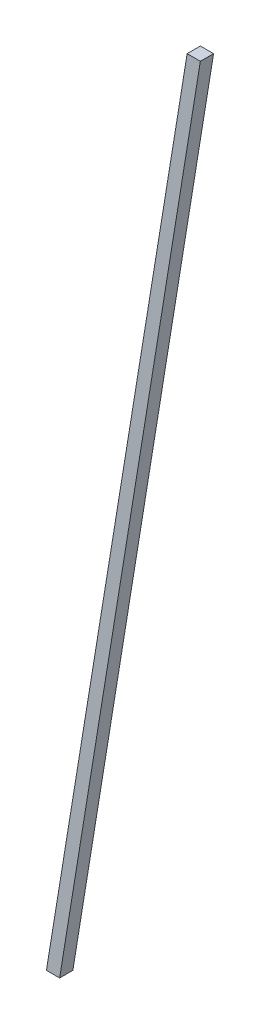
ISO-10303-21;
HEADER;
FILE_DESCRIPTION(('STEP AP214'),'2;1');
FILE_NAME('part.step','',(''),(''),'','','');
FILE_SCHEMA(('AUTOMOTIVE_DESIGN { 1 0 10303 214 1 1 1 1 }'));
ENDSEC;
DATA;
#1=APPLICATION_CONTEXT('core data for automotive mechanical design processes');
#2=APPLICATION_PROTOCOL_DEFINITION('international standard','automotive_design',2000,#1);
#3=PRODUCT_CONTEXT('',#1,'mechanical');
#4=PRODUCT('Part','Part','',(#3));
#5=PRODUCT_RELATED_PRODUCT_CATEGORY('part','',(#4));
#6=PRODUCT_DEFINITION_FORMATION('','',#4);
#7=PRODUCT_DEFINITION_CONTEXT('part definition',#1,'design');
#8=PRODUCT_DEFINITION('design','',#6,#7);
#9=PRODUCT_DEFINITION_SHAPE('','',#8);
#10=(LENGTH_UNIT() NAMED_UNIT(*) SI_UNIT(.MILLI.,.METRE.));
#11=(NAMED_UNIT(*) PLANE_ANGLE_UNIT() SI_UNIT($,.RADIAN.));
#12=(NAMED_UNIT(*) SI_UNIT($,.STERADIAN.) SOLID_ANGLE_UNIT());
#13=UNCERTAINTY_MEASURE_WITH_UNIT(LENGTH_MEASURE(1.E-05),#10,'distance_accuracy_value','');
#14=(GEOMETRIC_REPRESENTATION_CONTEXT(3) GLOBAL_UNCERTAINTY_ASSIGNED_CONTEXT((#13)) GLOBAL_UNIT_ASSIGNED_CONTEXT((#10,
#11,#12)) REPRESENTATION_CONTEXT('',''));
#15=CARTESIAN_POINT('',(0.,0.,0.));
#16=DIRECTION('',(0.,0.,1.));
#17=DIRECTION('',(1.,0.,0.));
#18=AXIS2_PLACEMENT_3D('',#15,#16,#17);
#19=CARTESIAN_POINT('',(72.0976824400948,329.578743165487,5.));
#20=DIRECTION('',(0.,-1.,0.));
#21=DIRECTION('',(0.,0.,-1.));
#22=AXIS2_PLACEMENT_3D('',#19,#20,#21);
#23=PLANE('',#22);
#24=DIRECTION('',(-1.,0.,0.));
#25=VECTOR('',#24,1.);
#26=CARTESIAN_POINT('',(72.0976824400948,329.578743165487,0.));
#27=LINE('',#26,#25);
#28=CARTESIAN_POINT('',(77.0976824400948,329.578743165487,0.));
#29=VERTEX_POINT('',#28);
#30=CARTESIAN_POINT('',(72.0976824400948,329.578743165487,0.));
#31=VERTEX_POINT('',#30);
#32=EDGE_CURVE('E96',#29,#31,#27,.T.);
#33=ORIENTED_EDGE('',*,*,#32,.T.);
#34=DIRECTION('',(0.,0.,-1.));
#35=VECTOR('',#34,1.);
#36=CARTESIAN_POINT('',(72.0976824400948,329.578743165487,5.));
#37=LINE('',#36,#35);
#38=CARTESIAN_POINT('',(72.0976824400948,329.578743165487,5.));
#39=VERTEX_POINT('',#38);
#40=EDGE_CURVE('E11',#39,#31,#37,.T.);
#41=ORIENTED_EDGE('',*,*,#40,.F.);
#42=DIRECTION('',(-1.,0.,0.));
#43=VECTOR('',#42,1.);
#44=CARTESIAN_POINT('',(72.0976824400948,329.578743165487,5.));
#45=LINE('',#44,#43);
#46=CARTESIAN_POINT('',(77.0976824400948,329.578743165487,5.));
#47=VERTEX_POINT('',#46);
#48=EDGE_CURVE('E84',#47,#39,#45,.T.);
#49=ORIENTED_EDGE('',*,*,#48,.F.);
#50=DIRECTION('',(0.,0.,-1.));
#51=VECTOR('',#50,1.);
#52=CARTESIAN_POINT('',(77.0976824400948,329.578743165487,5.));
#53=LINE('',#52,#51);
#54=EDGE_CURVE('E92',#47,#29,#53,.T.);
#55=ORIENTED_EDGE('',*,*,#54,.T.);
#56=EDGE_LOOP('',(#33,#41,#49,#55));
#57=FACE_BOUND('',#56,.T.);
#58=ADVANCED_FACE('F33',(#57),#23,.F.);
#59=CARTESIAN_POINT('',(72.0976824400948,329.578743165487,5.));
#60=DIRECTION('',(0.987003246317877,-0.16070031660819,0.));
#61=DIRECTION('',(0.16070031660819,0.987003246317877,0.));
#62=AXIS2_PLACEMENT_3D('',#59,#60,#61);
#63=PLANE('',#62);
#64=DIRECTION('',(-0.16070031660819,-0.987003246317877,0.));
#65=VECTOR('',#64,1.);
#66=CARTESIAN_POINT('',(72.0976824400948,329.578743165487,0.));
#67=LINE('',#66,#65);
#68=CARTESIAN_POINT('',(18.8567192245055,2.57874316549243,0.));
#69=VERTEX_POINT('',#68);
#70=EDGE_CURVE('E88',#31,#69,#67,.T.);
#71=ORIENTED_EDGE('',*,*,#70,.T.);
#72=DIRECTION('',(0.,0.,-1.));
#73=VECTOR('',#72,1.);
#74=CARTESIAN_POINT('',(18.8567192245055,2.57874316549243,5.));
#75=LINE('',#74,#73);
#76=CARTESIAN_POINT('',(18.8567192245055,2.57874316549243,5.));
#77=VERTEX_POINT('',#76);
#78=EDGE_CURVE('E41',#77,#69,#75,.T.);
#79=ORIENTED_EDGE('',*,*,#78,.F.);
#80=DIRECTION('',(-0.16070031660819,-0.987003246317877,0.));
#81=VECTOR('',#80,1.);
#82=CARTESIAN_POINT('',(72.0976824400948,329.578743165487,5.));
#83=LINE('',#82,#81);
#84=EDGE_CURVE('E79',#39,#77,#83,.T.);
#85=ORIENTED_EDGE('',*,*,#84,.F.);
#86=ORIENTED_EDGE('',*,*,#40,.T.);
#87=EDGE_LOOP('',(#71,#79,#85,#86));
#88=FACE_BOUND('',#87,.T.);
#89=ADVANCED_FACE('F87',(#88),#63,.F.);
#90=CARTESIAN_POINT('',(18.8567192245055,2.57874316549243,5.));
#91=DIRECTION('',(0.,1.,0.));
#92=DIRECTION('',(0.,0.,1.));
#93=AXIS2_PLACEMENT_3D('',#90,#91,#92);
#94=PLANE('',#93);
#95=DIRECTION('',(1.,0.,0.));
#96=VECTOR('',#95,1.);
#97=CARTESIAN_POINT('',(18.8567192245055,2.57874316549243,0.));
#98=LINE('',#97,#96);
#99=CARTESIAN_POINT('',(23.8567192245055,2.57874316549243,0.));
#100=VERTEX_POINT('',#99);
#101=EDGE_CURVE('E66',#69,#100,#98,.T.);
#102=ORIENTED_EDGE('',*,*,#101,.T.);
#103=DIRECTION('',(0.,0.,-1.));
#104=VECTOR('',#103,1.);
#105=CARTESIAN_POINT('',(23.8567192245055,2.57874316549243,5.));
#106=LINE('',#105,#104);
#107=CARTESIAN_POINT('',(23.8567192245055,2.57874316549243,5.));
#108=VERTEX_POINT('',#107);
#109=EDGE_CURVE('E89',#108,#100,#106,.T.);
#110=ORIENTED_EDGE('',*,*,#109,.F.);
#111=DIRECTION('',(1.,0.,0.));
#112=VECTOR('',#111,1.);
#113=CARTESIAN_POINT('',(18.8567192245055,2.57874316549243,5.));
#114=LINE('',#113,#112);
#115=EDGE_CURVE('E82',#77,#108,#114,.T.);
#116=ORIENTED_EDGE('',*,*,#115,.F.);
#117=ORIENTED_EDGE('',*,*,#78,.T.);
#118=EDGE_LOOP('',(#102,#110,#116,#117));
#119=FACE_BOUND('',#118,.T.);
#120=ADVANCED_FACE('F90',(#119),#94,.F.);
#121=CARTESIAN_POINT('',(77.0976824400948,329.578743165487,5.));
#122=DIRECTION('',(-0.987003246317877,0.16070031660819,0.));
#123=DIRECTION('',(-0.16070031660819,-0.987003246317877,0.));
#124=AXIS2_PLACEMENT_3D('',#121,#122,#123);
#125=PLANE('',#124);
#126=DIRECTION('',(0.16070031660819,0.987003246317877,0.));
#127=VECTOR('',#126,1.);
#128=CARTESIAN_POINT('',(77.0976824400948,329.578743165487,0.));
#129=LINE('',#128,#127);
#130=EDGE_CURVE('E72',#100,#29,#129,.T.);
#131=ORIENTED_EDGE('',*,*,#130,.T.);
#132=ORIENTED_EDGE('',*,*,#54,.F.);
#133=DIRECTION('',(0.16070031660819,0.987003246317877,0.));
#134=VECTOR('',#133,1.);
#135=CARTESIAN_POINT('',(77.0976824400948,329.578743165487,5.));
#136=LINE('',#135,#134);
#137=EDGE_CURVE('E49',#108,#47,#136,.T.);
#138=ORIENTED_EDGE('',*,*,#137,.F.);
#139=ORIENTED_EDGE('',*,*,#109,.T.);
#140=EDGE_LOOP('',(#131,#132,#138,#139));
#141=FACE_BOUND('',#140,.T.);
#142=ADVANCED_FACE('F103',(#141),#125,.F.);
#143=CARTESIAN_POINT('',(0.,0.,5.));
#144=DIRECTION('',(0.,0.,-1.));
#145=DIRECTION('',(-1.,0.,0.));
#146=AXIS2_PLACEMENT_3D('',#143,#144,#145);
#147=PLANE('',#146);
#148=ORIENTED_EDGE('',*,*,#48,.T.);
#149=ORIENTED_EDGE('',*,*,#84,.T.);
#150=ORIENTED_EDGE('',*,*,#115,.T.);
#151=ORIENTED_EDGE('',*,*,#137,.T.);
#152=EDGE_LOOP('',(#148,#149,#150,#151));
#153=FACE_BOUND('',#152,.T.);
#154=ADVANCED_FACE('F80',(#153),#147,.F.);
#155=CARTESIAN_POINT('',(0.,0.,0.));
#156=DIRECTION('',(0.,0.,-1.));
#157=DIRECTION('',(-1.,0.,0.));
#158=AXIS2_PLACEMENT_3D('',#155,#156,#157);
#159=PLANE('',#158);
#160=ORIENTED_EDGE('',*,*,#32,.F.);
#161=ORIENTED_EDGE('',*,*,#130,.F.);
#162=ORIENTED_EDGE('',*,*,#101,.F.);
#163=ORIENTED_EDGE('',*,*,#70,.F.);
#164=EDGE_LOOP('',(#160,#161,#162,#163));
#165=FACE_BOUND('',#164,.T.);
#166=ADVANCED_FACE('F106',(#165),#159,.T.);
#167=CLOSED_SHELL('',(#58,#89,#120,#142,#154,#166));
#168=MANIFOLD_SOLID_BREP('B2',#167);
#169=ADVANCED_BREP_SHAPE_REPRESENTATION('',(#18,#168),#14);
#170=SHAPE_DEFINITION_REPRESENTATION(#9,#169);
ENDSEC;
END-ISO-10303-21;
